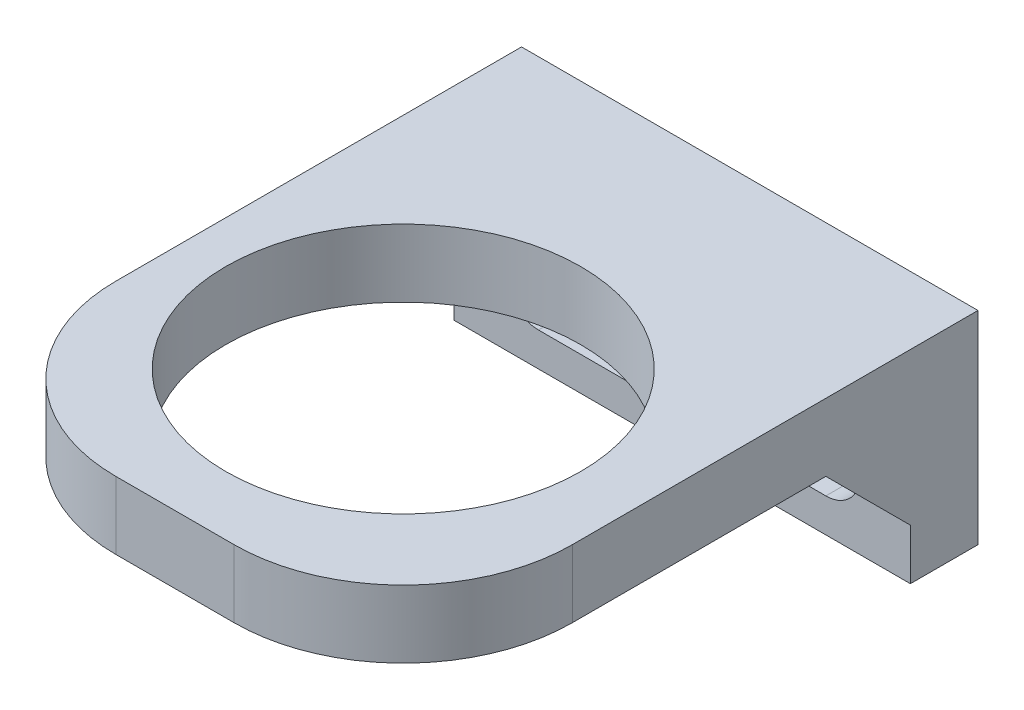
ISO-10303-21;
HEADER;
FILE_DESCRIPTION(('STEP AP214'),'2;1');
FILE_NAME('part.step','',(''),(''),'','','');
FILE_SCHEMA(('AUTOMOTIVE_DESIGN { 1 0 10303 214 1 1 1 1 }'));
ENDSEC;
DATA;
#1=APPLICATION_CONTEXT('core data for automotive mechanical design processes');
#2=APPLICATION_PROTOCOL_DEFINITION('international standard','automotive_design',2000,#1);
#3=PRODUCT_CONTEXT('',#1,'mechanical');
#4=PRODUCT('Part','Part','',(#3));
#5=PRODUCT_RELATED_PRODUCT_CATEGORY('part','',(#4));
#6=PRODUCT_DEFINITION_FORMATION('','',#4);
#7=PRODUCT_DEFINITION_CONTEXT('part definition',#1,'design');
#8=PRODUCT_DEFINITION('design','',#6,#7);
#9=PRODUCT_DEFINITION_SHAPE('','',#8);
#10=(LENGTH_UNIT() NAMED_UNIT(*) SI_UNIT(.MILLI.,.METRE.));
#11=(NAMED_UNIT(*) PLANE_ANGLE_UNIT() SI_UNIT($,.RADIAN.));
#12=(NAMED_UNIT(*) SI_UNIT($,.STERADIAN.) SOLID_ANGLE_UNIT());
#13=UNCERTAINTY_MEASURE_WITH_UNIT(LENGTH_MEASURE(1.E-05),#10,'distance_accuracy_value','');
#14=(GEOMETRIC_REPRESENTATION_CONTEXT(3) GLOBAL_UNCERTAINTY_ASSIGNED_CONTEXT((#13)) GLOBAL_UNIT_ASSIGNED_CONTEXT((#10,
#11,#12)) REPRESENTATION_CONTEXT('',''));
#15=CARTESIAN_POINT('',(0.,0.,0.));
#16=DIRECTION('',(0.,0.,1.));
#17=DIRECTION('',(1.,0.,0.));
#18=AXIS2_PLACEMENT_3D('',#15,#16,#17);
#19=CARTESIAN_POINT('',(0.,0.,0.));
#20=DIRECTION('',(0.,1.,0.));
#21=DIRECTION('',(0.,0.,1.));
#22=AXIS2_PLACEMENT_3D('',#19,#20,#21);
#23=PLANE('',#22);
#24=CARTESIAN_POINT('',(0.,0.,0.));
#25=DIRECTION('',(0.,1.,0.));
#26=DIRECTION('',(0.,0.,1.));
#27=AXIS2_PLACEMENT_3D('',#24,#25,#26);
#28=CIRCLE('',#27,10.5);
#29=CARTESIAN_POINT('',(0.,0.,10.5));
#30=VERTEX_POINT('',#29);
#31=EDGE_CURVE('E266',#30,#30,#28,.T.);
#32=ORIENTED_EDGE('',*,*,#31,.T.);
#33=EDGE_LOOP('',(#32));
#34=FACE_BOUND('',#33,.T.);
#35=DIRECTION('',(1.,0.,0.));
#36=VECTOR('',#35,1.);
#37=CARTESIAN_POINT('',(-13.,0.,14.));
#38=LINE('',#37,#36);
#39=CARTESIAN_POINT('',(-3.,0.,14.));
#40=VERTEX_POINT('',#39);
#41=CARTESIAN_POINT('',(4.,0.,14.));
#42=VERTEX_POINT('',#41);
#43=EDGE_CURVE('E252',#40,#42,#38,.T.);
#44=ORIENTED_EDGE('',*,*,#43,.F.);
#45=CARTESIAN_POINT('',(-3.,0.,4.));
#46=DIRECTION('',(0.,1.,0.));
#47=DIRECTION('',(0.,0.,1.));
#48=AXIS2_PLACEMENT_3D('',#45,#46,#47);
#49=CIRCLE('',#48,10.);
#50=CARTESIAN_POINT('',(-13.,0.,4.));
#51=VERTEX_POINT('',#50);
#52=EDGE_CURVE('E303',#40,#51,#49,.F.);
#53=ORIENTED_EDGE('',*,*,#52,.T.);
#54=DIRECTION('',(0.,0.,1.));
#55=VECTOR('',#54,1.);
#56=CARTESIAN_POINT('',(-13.,0.,-20.));
#57=LINE('',#56,#55);
#58=CARTESIAN_POINT('',(-13.,0.,-11.0000000000001));
#59=VERTEX_POINT('',#58);
#60=EDGE_CURVE('E238',#59,#51,#57,.T.);
#61=ORIENTED_EDGE('',*,*,#60,.F.);
#62=DIRECTION('',(-1.,0.,0.));
#63=VECTOR('',#62,1.);
#64=CARTESIAN_POINT('',(-11.,0.,-11.0000000000001));
#65=LINE('',#64,#63);
#66=CARTESIAN_POINT('',(-11.,0.,-11.0000000000001));
#67=VERTEX_POINT('',#66);
#68=EDGE_CURVE('E215',#67,#59,#65,.T.);
#69=ORIENTED_EDGE('',*,*,#68,.F.);
#70=DIRECTION('',(0.,0.,-1.));
#71=VECTOR('',#70,1.);
#72=CARTESIAN_POINT('',(-11.,0.,-11.0000000000001));
#73=LINE('',#72,#71);
#74=CARTESIAN_POINT('',(-11.,0.,-16.));
#75=VERTEX_POINT('',#74);
#76=EDGE_CURVE('E203',#67,#75,#73,.T.);
#77=ORIENTED_EDGE('',*,*,#76,.T.);
#78=DIRECTION('',(-1.,0.,0.));
#79=VECTOR('',#78,1.);
#80=CARTESIAN_POINT('',(-13.,0.,-16.));
#81=LINE('',#80,#79);
#82=CARTESIAN_POINT('',(12.,0.,-16.));
#83=VERTEX_POINT('',#82);
#84=EDGE_CURVE('E217',#83,#75,#81,.T.);
#85=ORIENTED_EDGE('',*,*,#84,.F.);
#86=DIRECTION('',(0.,0.,1.));
#87=VECTOR('',#86,1.);
#88=CARTESIAN_POINT('',(12.,0.,-16.));
#89=LINE('',#88,#87);
#90=CARTESIAN_POINT('',(12.,0.,-11.));
#91=VERTEX_POINT('',#90);
#92=EDGE_CURVE('E189',#83,#91,#89,.T.);
#93=ORIENTED_EDGE('',*,*,#92,.T.);
#94=DIRECTION('',(1.,0.,0.));
#95=VECTOR('',#94,1.);
#96=CARTESIAN_POINT('',(12.,0.,-11.));
#97=LINE('',#96,#95);
#98=CARTESIAN_POINT('',(14.,0.,-11.));
#99=VERTEX_POINT('',#98);
#100=EDGE_CURVE('E194',#91,#99,#97,.T.);
#101=ORIENTED_EDGE('',*,*,#100,.T.);
#102=DIRECTION('',(0.,0.,-1.));
#103=VECTOR('',#102,1.);
#104=CARTESIAN_POINT('',(14.,0.,-20.));
#105=LINE('',#104,#103);
#106=CARTESIAN_POINT('',(14.,0.,4.));
#107=VERTEX_POINT('',#106);
#108=EDGE_CURVE('E248',#107,#99,#105,.T.);
#109=ORIENTED_EDGE('',*,*,#108,.F.);
#110=CARTESIAN_POINT('',(4.,0.,4.));
#111=DIRECTION('',(0.,1.,0.));
#112=DIRECTION('',(0.,0.,1.));
#113=AXIS2_PLACEMENT_3D('',#110,#111,#112);
#114=CIRCLE('',#113,10.);
#115=EDGE_CURVE('E247',#107,#42,#114,.F.);
#116=ORIENTED_EDGE('',*,*,#115,.T.);
#117=EDGE_LOOP('',(#44,#53,#61,#69,#77,#85,#93,#101,#109,#116));
#118=FACE_BOUND('',#117,.T.);
#119=ADVANCED_FACE('F37',(#34,#118),#23,.F.);
#120=CARTESIAN_POINT('',(0.,4.,0.));
#121=DIRECTION('',(0.,1.,0.));
#122=DIRECTION('',(0.,0.,1.));
#123=AXIS2_PLACEMENT_3D('',#120,#121,#122);
#124=PLANE('',#123);
#125=DIRECTION('',(0.,0.,1.));
#126=VECTOR('',#125,1.);
#127=CARTESIAN_POINT('',(-13.,4.,-20.));
#128=LINE('',#127,#126);
#129=CARTESIAN_POINT('',(-13.,4.,-20.));
#130=VERTEX_POINT('',#129);
#131=CARTESIAN_POINT('',(-13.,4.,4.));
#132=VERTEX_POINT('',#131);
#133=EDGE_CURVE('E251',#130,#132,#128,.T.);
#134=ORIENTED_EDGE('',*,*,#133,.T.);
#135=CARTESIAN_POINT('',(-3.,4.,4.));
#136=DIRECTION('',(0.,1.,0.));
#137=DIRECTION('',(0.,0.,1.));
#138=AXIS2_PLACEMENT_3D('',#135,#136,#137);
#139=CIRCLE('',#138,10.);
#140=CARTESIAN_POINT('',(-3.,4.,14.));
#141=VERTEX_POINT('',#140);
#142=EDGE_CURVE('E45',#132,#141,#139,.T.);
#143=ORIENTED_EDGE('',*,*,#142,.T.);
#144=DIRECTION('',(1.,0.,0.));
#145=VECTOR('',#144,1.);
#146=CARTESIAN_POINT('',(-13.,4.,14.));
#147=LINE('',#146,#145);
#148=CARTESIAN_POINT('',(4.,4.,14.));
#149=VERTEX_POINT('',#148);
#150=EDGE_CURVE('E278',#141,#149,#147,.T.);
#151=ORIENTED_EDGE('',*,*,#150,.T.);
#152=CARTESIAN_POINT('',(4.,4.,4.));
#153=DIRECTION('',(0.,1.,0.));
#154=DIRECTION('',(0.,0.,1.));
#155=AXIS2_PLACEMENT_3D('',#152,#153,#154);
#156=CIRCLE('',#155,10.);
#157=CARTESIAN_POINT('',(14.,4.,4.));
#158=VERTEX_POINT('',#157);
#159=EDGE_CURVE('E302',#149,#158,#156,.T.);
#160=ORIENTED_EDGE('',*,*,#159,.T.);
#161=DIRECTION('',(0.,0.,-1.));
#162=VECTOR('',#161,1.);
#163=CARTESIAN_POINT('',(14.,4.,-20.));
#164=LINE('',#163,#162);
#165=CARTESIAN_POINT('',(14.,4.,-20.));
#166=VERTEX_POINT('',#165);
#167=EDGE_CURVE('E281',#158,#166,#164,.T.);
#168=ORIENTED_EDGE('',*,*,#167,.T.);
#169=DIRECTION('',(-1.,0.,0.));
#170=VECTOR('',#169,1.);
#171=CARTESIAN_POINT('',(-13.,4.,-20.));
#172=LINE('',#171,#170);
#173=EDGE_CURVE('E259',#166,#130,#172,.T.);
#174=ORIENTED_EDGE('',*,*,#173,.T.);
#175=EDGE_LOOP('',(#134,#143,#151,#160,#168,#174));
#176=FACE_BOUND('',#175,.T.);
#177=CARTESIAN_POINT('',(0.,4.,0.));
#178=DIRECTION('',(0.,1.,0.));
#179=DIRECTION('',(0.,0.,1.));
#180=AXIS2_PLACEMENT_3D('',#177,#178,#179);
#181=CIRCLE('',#180,10.5);
#182=CARTESIAN_POINT('',(0.,4.,10.5));
#183=VERTEX_POINT('',#182);
#184=EDGE_CURVE('E233',#183,#183,#181,.T.);
#185=ORIENTED_EDGE('',*,*,#184,.F.);
#186=EDGE_LOOP('',(#185));
#187=FACE_BOUND('',#186,.T.);
#188=ADVANCED_FACE('F287',(#176,#187),#124,.T.);
#189=CARTESIAN_POINT('',(-13.,4.,-20.));
#190=DIRECTION('',(1.,0.,0.));
#191=DIRECTION('',(0.,0.,-1.));
#192=AXIS2_PLACEMENT_3D('',#189,#190,#191);
#193=PLANE('',#192);
#194=ORIENTED_EDGE('',*,*,#60,.T.);
#195=DIRECTION('',(0.,-1.,0.));
#196=VECTOR('',#195,1.);
#197=CARTESIAN_POINT('',(-13.,4.,4.));
#198=LINE('',#197,#196);
#199=EDGE_CURVE('E299',#51,#132,#198,.F.);
#200=ORIENTED_EDGE('',*,*,#199,.T.);
#201=ORIENTED_EDGE('',*,*,#133,.F.);
#202=DIRECTION('',(0.,-1.,0.));
#203=VECTOR('',#202,1.);
#204=CARTESIAN_POINT('',(-13.,4.,-20.));
#205=LINE('',#204,#203);
#206=CARTESIAN_POINT('',(-13.,-8.,-20.));
#207=VERTEX_POINT('',#206);
#208=EDGE_CURVE('E257',#130,#207,#205,.T.);
#209=ORIENTED_EDGE('',*,*,#208,.T.);
#210=DIRECTION('',(0.,0.,-1.));
#211=VECTOR('',#210,1.);
#212=CARTESIAN_POINT('',(-13.,-8.,-20.));
#213=LINE('',#212,#211);
#214=CARTESIAN_POINT('',(-13.,-8.,-16.));
#215=VERTEX_POINT('',#214);
#216=EDGE_CURVE('E220',#215,#207,#213,.T.);
#217=ORIENTED_EDGE('',*,*,#216,.F.);
#218=DIRECTION('',(0.,1.,0.));
#219=VECTOR('',#218,1.);
#220=CARTESIAN_POINT('',(-13.,-8.,-16.));
#221=LINE('',#220,#219);
#222=CARTESIAN_POINT('',(-13.,-5.,-16.));
#223=VERTEX_POINT('',#222);
#224=EDGE_CURVE('E230',#215,#223,#221,.T.);
#225=ORIENTED_EDGE('',*,*,#224,.T.);
#226=DIRECTION('',(0.,0.707106781186552,0.707106781186543));
#227=VECTOR('',#226,1.);
#228=CARTESIAN_POINT('',(-13.,-5.,-16.));
#229=LINE('',#228,#227);
#230=EDGE_CURVE('E200',#223,#59,#229,.T.);
#231=ORIENTED_EDGE('',*,*,#230,.T.);
#232=EDGE_LOOP('',(#194,#200,#201,#209,#217,#225,#231));
#233=FACE_BOUND('',#232,.T.);
#234=ADVANCED_FACE('F297',(#233),#193,.F.);
#235=CARTESIAN_POINT('',(-13.,4.,14.));
#236=DIRECTION('',(0.,0.,-1.));
#237=DIRECTION('',(-1.,0.,0.));
#238=AXIS2_PLACEMENT_3D('',#235,#236,#237);
#239=PLANE('',#238);
#240=ORIENTED_EDGE('',*,*,#150,.F.);
#241=DIRECTION('',(0.,-1.,0.));
#242=VECTOR('',#241,1.);
#243=CARTESIAN_POINT('',(-3.,4.,14.));
#244=LINE('',#243,#242);
#245=EDGE_CURVE('E243',#141,#40,#244,.T.);
#246=ORIENTED_EDGE('',*,*,#245,.T.);
#247=ORIENTED_EDGE('',*,*,#43,.T.);
#248=DIRECTION('',(0.,-1.,0.));
#249=VECTOR('',#248,1.);
#250=CARTESIAN_POINT('',(4.,4.,14.));
#251=LINE('',#250,#249);
#252=EDGE_CURVE('E241',#42,#149,#251,.F.);
#253=ORIENTED_EDGE('',*,*,#252,.T.);
#254=EDGE_LOOP('',(#240,#246,#247,#253));
#255=FACE_BOUND('',#254,.T.);
#256=ADVANCED_FACE('F310',(#255),#239,.F.);
#257=CARTESIAN_POINT('',(14.,4.,-20.));
#258=DIRECTION('',(-1.,0.,0.));
#259=DIRECTION('',(0.,0.,1.));
#260=AXIS2_PLACEMENT_3D('',#257,#258,#259);
#261=PLANE('',#260);
#262=ORIENTED_EDGE('',*,*,#167,.F.);
#263=DIRECTION('',(0.,-1.,0.));
#264=VECTOR('',#263,1.);
#265=CARTESIAN_POINT('',(14.,4.,4.));
#266=LINE('',#265,#264);
#267=EDGE_CURVE('E11',#158,#107,#266,.T.);
#268=ORIENTED_EDGE('',*,*,#267,.T.);
#269=ORIENTED_EDGE('',*,*,#108,.T.);
#270=DIRECTION('',(0.,-0.707106781186544,-0.707106781186551));
#271=VECTOR('',#270,1.);
#272=CARTESIAN_POINT('',(14.,0.,-11.));
#273=LINE('',#272,#271);
#274=CARTESIAN_POINT('',(14.,-5.,-16.));
#275=VERTEX_POINT('',#274);
#276=EDGE_CURVE('E183',#99,#275,#273,.T.);
#277=ORIENTED_EDGE('',*,*,#276,.T.);
#278=DIRECTION('',(0.,1.,0.));
#279=VECTOR('',#278,1.);
#280=CARTESIAN_POINT('',(14.,-8.,-16.));
#281=LINE('',#280,#279);
#282=CARTESIAN_POINT('',(14.,-8.,-16.));
#283=VERTEX_POINT('',#282);
#284=EDGE_CURVE('E263',#283,#275,#281,.T.);
#285=ORIENTED_EDGE('',*,*,#284,.F.);
#286=DIRECTION('',(0.,0.,1.));
#287=VECTOR('',#286,1.);
#288=CARTESIAN_POINT('',(14.,-8.,-20.));
#289=LINE('',#288,#287);
#290=CARTESIAN_POINT('',(14.,-8.,-20.));
#291=VERTEX_POINT('',#290);
#292=EDGE_CURVE('E226',#291,#283,#289,.T.);
#293=ORIENTED_EDGE('',*,*,#292,.F.);
#294=DIRECTION('',(0.,-1.,0.));
#295=VECTOR('',#294,1.);
#296=CARTESIAN_POINT('',(14.,4.,-20.));
#297=LINE('',#296,#295);
#298=EDGE_CURVE('E244',#166,#291,#297,.T.);
#299=ORIENTED_EDGE('',*,*,#298,.F.);
#300=EDGE_LOOP('',(#262,#268,#269,#277,#285,#293,#299));
#301=FACE_BOUND('',#300,.T.);
#302=ADVANCED_FACE('F321',(#301),#261,.F.);
#303=CARTESIAN_POINT('',(-13.,4.,-20.));
#304=DIRECTION('',(0.,0.,1.));
#305=DIRECTION('',(1.,0.,0.));
#306=AXIS2_PLACEMENT_3D('',#303,#304,#305);
#307=PLANE('',#306);
#308=DIRECTION('',(-1.,0.,0.));
#309=VECTOR('',#308,1.);
#310=CARTESIAN_POINT('',(-8.,-2.,-20.));
#311=LINE('',#310,#309);
#312=CARTESIAN_POINT('',(9.,-2.,-20.));
#313=VERTEX_POINT('',#312);
#314=CARTESIAN_POINT('',(-8.,-2.,-20.));
#315=VERTEX_POINT('',#314);
#316=EDGE_CURVE('E158',#313,#315,#311,.T.);
#317=ORIENTED_EDGE('',*,*,#316,.T.);
#318=CARTESIAN_POINT('',(-8.,-4.,-20.));
#319=DIRECTION('',(0.,0.,1.));
#320=DIRECTION('',(1.,0.,0.));
#321=AXIS2_PLACEMENT_3D('',#318,#319,#320);
#322=CIRCLE('',#321,2.);
#323=CARTESIAN_POINT('',(-8.,-6.,-20.));
#324=VERTEX_POINT('',#323);
#325=EDGE_CURVE('E152',#315,#324,#322,.T.);
#326=ORIENTED_EDGE('',*,*,#325,.T.);
#327=DIRECTION('',(1.,0.,0.));
#328=VECTOR('',#327,1.);
#329=CARTESIAN_POINT('',(-8.,-6.,-20.));
#330=LINE('',#329,#328);
#331=CARTESIAN_POINT('',(9.,-6.,-20.));
#332=VERTEX_POINT('',#331);
#333=EDGE_CURVE('E161',#324,#332,#330,.T.);
#334=ORIENTED_EDGE('',*,*,#333,.T.);
#335=CARTESIAN_POINT('',(9.,-4.,-20.));
#336=DIRECTION('',(0.,0.,1.));
#337=DIRECTION('',(1.,0.,0.));
#338=AXIS2_PLACEMENT_3D('',#335,#336,#337);
#339=CIRCLE('',#338,2.);
#340=EDGE_CURVE('E52',#332,#313,#339,.T.);
#341=ORIENTED_EDGE('',*,*,#340,.T.);
#342=EDGE_LOOP('',(#317,#326,#334,#341));
#343=FACE_BOUND('',#342,.T.);
#344=ORIENTED_EDGE('',*,*,#298,.T.);
#345=DIRECTION('',(1.,0.,0.));
#346=VECTOR('',#345,1.);
#347=CARTESIAN_POINT('',(-13.,-8.,-20.));
#348=LINE('',#347,#346);
#349=EDGE_CURVE('E223',#207,#291,#348,.T.);
#350=ORIENTED_EDGE('',*,*,#349,.F.);
#351=ORIENTED_EDGE('',*,*,#208,.F.);
#352=ORIENTED_EDGE('',*,*,#173,.F.);
#353=EDGE_LOOP('',(#344,#350,#351,#352));
#354=FACE_BOUND('',#353,.T.);
#355=ADVANCED_FACE('F165',(#343,#354),#307,.F.);
#356=CARTESIAN_POINT('',(0.,4.,0.));
#357=DIRECTION('',(0.,-1.,0.));
#358=DIRECTION('',(0.,0.,-1.));
#359=AXIS2_PLACEMENT_3D('',#356,#357,#358);
#360=CYLINDRICAL_SURFACE('',#359,10.5);
#361=ORIENTED_EDGE('',*,*,#184,.T.);
#362=EDGE_LOOP('',(#361));
#363=FACE_BOUND('',#362,.T.);
#364=ORIENTED_EDGE('',*,*,#31,.F.);
#365=EDGE_LOOP('',(#364));
#366=FACE_BOUND('',#365,.T.);
#367=ADVANCED_FACE('F361',(#363,#366),#360,.F.);
#368=CARTESIAN_POINT('',(-13.,-8.,-16.));
#369=DIRECTION('',(0.,0.,-1.));
#370=DIRECTION('',(-1.,0.,0.));
#371=AXIS2_PLACEMENT_3D('',#368,#369,#370);
#372=PLANE('',#371);
#373=DIRECTION('',(1.,0.,0.));
#374=VECTOR('',#373,1.);
#375=CARTESIAN_POINT('',(-8.,-6.,-16.));
#376=LINE('',#375,#374);
#377=CARTESIAN_POINT('',(-8.,-6.,-16.));
#378=VERTEX_POINT('',#377);
#379=CARTESIAN_POINT('',(9.,-6.,-16.));
#380=VERTEX_POINT('',#379);
#381=EDGE_CURVE('E177',#378,#380,#376,.T.);
#382=ORIENTED_EDGE('',*,*,#381,.F.);
#383=CARTESIAN_POINT('',(-8.,-4.,-16.));
#384=DIRECTION('',(0.,0.,1.));
#385=DIRECTION('',(1.,0.,0.));
#386=AXIS2_PLACEMENT_3D('',#383,#384,#385);
#387=CIRCLE('',#386,2.);
#388=CARTESIAN_POINT('',(-8.,-2.,-16.));
#389=VERTEX_POINT('',#388);
#390=EDGE_CURVE('E60',#389,#378,#387,.T.);
#391=ORIENTED_EDGE('',*,*,#390,.F.);
#392=DIRECTION('',(-1.,0.,0.));
#393=VECTOR('',#392,1.);
#394=CARTESIAN_POINT('',(-8.,-2.,-16.));
#395=LINE('',#394,#393);
#396=CARTESIAN_POINT('',(9.,-2.,-16.));
#397=VERTEX_POINT('',#396);
#398=EDGE_CURVE('E168',#397,#389,#395,.T.);
#399=ORIENTED_EDGE('',*,*,#398,.F.);
#400=CARTESIAN_POINT('',(9.,-4.,-16.));
#401=DIRECTION('',(0.,0.,1.));
#402=DIRECTION('',(1.,0.,0.));
#403=AXIS2_PLACEMENT_3D('',#400,#401,#402);
#404=CIRCLE('',#403,2.);
#405=EDGE_CURVE('E171',#380,#397,#404,.T.);
#406=ORIENTED_EDGE('',*,*,#405,.F.);
#407=EDGE_LOOP('',(#382,#391,#399,#406));
#408=FACE_BOUND('',#407,.T.);
#409=ORIENTED_EDGE('',*,*,#284,.T.);
#410=DIRECTION('',(1.,0.,0.));
#411=VECTOR('',#410,1.);
#412=CARTESIAN_POINT('',(12.,-5.,-16.));
#413=LINE('',#412,#411);
#414=CARTESIAN_POINT('',(12.,-5.,-16.));
#415=VERTEX_POINT('',#414);
#416=EDGE_CURVE('E197',#415,#275,#413,.T.);
#417=ORIENTED_EDGE('',*,*,#416,.F.);
#418=DIRECTION('',(0.,1.,0.));
#419=VECTOR('',#418,1.);
#420=CARTESIAN_POINT('',(12.,-5.,-16.));
#421=LINE('',#420,#419);
#422=EDGE_CURVE('E187',#415,#83,#421,.T.);
#423=ORIENTED_EDGE('',*,*,#422,.T.);
#424=ORIENTED_EDGE('',*,*,#84,.T.);
#425=DIRECTION('',(0.,-1.,0.));
#426=VECTOR('',#425,1.);
#427=CARTESIAN_POINT('',(-11.,0.,-16.));
#428=LINE('',#427,#426);
#429=CARTESIAN_POINT('',(-11.,-5.,-16.));
#430=VERTEX_POINT('',#429);
#431=EDGE_CURVE('E206',#75,#430,#428,.T.);
#432=ORIENTED_EDGE('',*,*,#431,.T.);
#433=DIRECTION('',(-1.,0.,0.));
#434=VECTOR('',#433,1.);
#435=CARTESIAN_POINT('',(-11.,-5.,-16.));
#436=LINE('',#435,#434);
#437=EDGE_CURVE('E212',#430,#223,#436,.T.);
#438=ORIENTED_EDGE('',*,*,#437,.T.);
#439=ORIENTED_EDGE('',*,*,#224,.F.);
#440=DIRECTION('',(-1.,0.,0.));
#441=VECTOR('',#440,1.);
#442=CARTESIAN_POINT('',(-13.,-8.,-16.));
#443=LINE('',#442,#441);
#444=EDGE_CURVE('E228',#283,#215,#443,.T.);
#445=ORIENTED_EDGE('',*,*,#444,.F.);
#446=EDGE_LOOP('',(#409,#417,#423,#424,#432,#438,#439,#445));
#447=FACE_BOUND('',#446,.T.);
#448=ADVANCED_FACE('F326',(#408,#447),#372,.F.);
#449=CARTESIAN_POINT('',(0.,-8.,0.));
#450=DIRECTION('',(0.,1.,0.));
#451=DIRECTION('',(0.,0.,1.));
#452=AXIS2_PLACEMENT_3D('',#449,#450,#451);
#453=PLANE('',#452);
#454=ORIENTED_EDGE('',*,*,#216,.T.);
#455=ORIENTED_EDGE('',*,*,#349,.T.);
#456=ORIENTED_EDGE('',*,*,#292,.T.);
#457=ORIENTED_EDGE('',*,*,#444,.T.);
#458=EDGE_LOOP('',(#454,#455,#456,#457));
#459=FACE_BOUND('',#458,.T.);
#460=ADVANCED_FACE('F324',(#459),#453,.F.);
#461=CARTESIAN_POINT('',(-11.,-5.,-16.));
#462=DIRECTION('',(0.,-0.707106781186543,0.707106781186552));
#463=DIRECTION('',(0.,-0.707106781186552,-0.707106781186543));
#464=AXIS2_PLACEMENT_3D('',#461,#462,#463);
#465=PLANE('',#464);
#466=ORIENTED_EDGE('',*,*,#230,.F.);
#467=ORIENTED_EDGE('',*,*,#437,.F.);
#468=DIRECTION('',(0.,0.707106781186552,0.707106781186543));
#469=VECTOR('',#468,1.);
#470=CARTESIAN_POINT('',(-11.,-5.,-16.));
#471=LINE('',#470,#469);
#472=EDGE_CURVE('E209',#430,#67,#471,.T.);
#473=ORIENTED_EDGE('',*,*,#472,.T.);
#474=ORIENTED_EDGE('',*,*,#68,.T.);
#475=EDGE_LOOP('',(#466,#467,#473,#474));
#476=FACE_BOUND('',#475,.T.);
#477=ADVANCED_FACE('F330',(#476),#465,.T.);
#478=CARTESIAN_POINT('',(-11.,0.,0.));
#479=DIRECTION('',(-1.,0.,0.));
#480=DIRECTION('',(0.,0.,1.));
#481=AXIS2_PLACEMENT_3D('',#478,#479,#480);
#482=PLANE('',#481);
#483=ORIENTED_EDGE('',*,*,#76,.F.);
#484=ORIENTED_EDGE('',*,*,#472,.F.);
#485=ORIENTED_EDGE('',*,*,#431,.F.);
#486=EDGE_LOOP('',(#483,#484,#485));
#487=FACE_BOUND('',#486,.T.);
#488=ADVANCED_FACE('F332',(#487),#482,.F.);
#489=CARTESIAN_POINT('',(12.,0.,-11.));
#490=DIRECTION('',(0.,-0.707106781186551,0.707106781186544));
#491=DIRECTION('',(0.,-0.707106781186544,-0.707106781186551));
#492=AXIS2_PLACEMENT_3D('',#489,#490,#491);
#493=PLANE('',#492);
#494=ORIENTED_EDGE('',*,*,#276,.F.);
#495=ORIENTED_EDGE('',*,*,#100,.F.);
#496=DIRECTION('',(0.,-0.707106781186544,-0.707106781186551));
#497=VECTOR('',#496,1.);
#498=CARTESIAN_POINT('',(12.,0.,-11.));
#499=LINE('',#498,#497);
#500=EDGE_CURVE('E191',#91,#415,#499,.T.);
#501=ORIENTED_EDGE('',*,*,#500,.T.);
#502=ORIENTED_EDGE('',*,*,#416,.T.);
#503=EDGE_LOOP('',(#494,#495,#501,#502));
#504=FACE_BOUND('',#503,.T.);
#505=ADVANCED_FACE('F342',(#504),#493,.T.);
#506=CARTESIAN_POINT('',(12.,0.,0.));
#507=DIRECTION('',(1.,0.,0.));
#508=DIRECTION('',(0.,0.,-1.));
#509=AXIS2_PLACEMENT_3D('',#506,#507,#508);
#510=PLANE('',#509);
#511=ORIENTED_EDGE('',*,*,#422,.F.);
#512=ORIENTED_EDGE('',*,*,#500,.F.);
#513=ORIENTED_EDGE('',*,*,#92,.F.);
#514=EDGE_LOOP('',(#511,#512,#513));
#515=FACE_BOUND('',#514,.T.);
#516=ADVANCED_FACE('F339',(#515),#510,.F.);
#517=CARTESIAN_POINT('',(-3.,4.,4.));
#518=DIRECTION('',(0.,-1.,0.));
#519=DIRECTION('',(0.,0.,-1.));
#520=AXIS2_PLACEMENT_3D('',#517,#518,#519);
#521=CYLINDRICAL_SURFACE('',#520,10.);
#522=ORIENTED_EDGE('',*,*,#142,.F.);
#523=ORIENTED_EDGE('',*,*,#199,.F.);
#524=ORIENTED_EDGE('',*,*,#52,.F.);
#525=ORIENTED_EDGE('',*,*,#245,.F.);
#526=EDGE_LOOP('',(#522,#523,#524,#525));
#527=FACE_BOUND('',#526,.T.);
#528=ADVANCED_FACE('F314',(#527),#521,.T.);
#529=CARTESIAN_POINT('',(4.,4.,4.));
#530=DIRECTION('',(0.,-1.,0.));
#531=DIRECTION('',(0.,0.,-1.));
#532=AXIS2_PLACEMENT_3D('',#529,#530,#531);
#533=CYLINDRICAL_SURFACE('',#532,10.);
#534=ORIENTED_EDGE('',*,*,#159,.F.);
#535=ORIENTED_EDGE('',*,*,#252,.F.);
#536=ORIENTED_EDGE('',*,*,#115,.F.);
#537=ORIENTED_EDGE('',*,*,#267,.F.);
#538=EDGE_LOOP('',(#534,#535,#536,#537));
#539=FACE_BOUND('',#538,.T.);
#540=ADVANCED_FACE('F39',(#539),#533,.T.);
#541=CARTESIAN_POINT('',(-8.,-4.,-20.));
#542=DIRECTION('',(0.,0.,1.));
#543=DIRECTION('',(1.,0.,0.));
#544=AXIS2_PLACEMENT_3D('',#541,#542,#543);
#545=CYLINDRICAL_SURFACE('',#544,2.);
#546=ORIENTED_EDGE('',*,*,#390,.T.);
#547=DIRECTION('',(0.,0.,1.));
#548=VECTOR('',#547,1.);
#549=CARTESIAN_POINT('',(-8.,-6.,-20.));
#550=LINE('',#549,#548);
#551=EDGE_CURVE('E148',#324,#378,#550,.T.);
#552=ORIENTED_EDGE('',*,*,#551,.F.);
#553=ORIENTED_EDGE('',*,*,#325,.F.);
#554=DIRECTION('',(0.,0.,1.));
#555=VECTOR('',#554,1.);
#556=CARTESIAN_POINT('',(-8.,-2.,-20.));
#557=LINE('',#556,#555);
#558=EDGE_CURVE('E181',#315,#389,#557,.T.);
#559=ORIENTED_EDGE('',*,*,#558,.T.);
#560=EDGE_LOOP('',(#546,#552,#553,#559));
#561=FACE_BOUND('',#560,.T.);
#562=ADVANCED_FACE('F150',(#561),#545,.F.);
#563=CARTESIAN_POINT('',(-8.,-2.,-20.));
#564=DIRECTION('',(0.,1.,0.));
#565=DIRECTION('',(-1.,0.,0.));
#566=AXIS2_PLACEMENT_3D('',#563,#564,#565);
#567=PLANE('',#566);
#568=ORIENTED_EDGE('',*,*,#398,.T.);
#569=ORIENTED_EDGE('',*,*,#558,.F.);
#570=ORIENTED_EDGE('',*,*,#316,.F.);
#571=DIRECTION('',(0.,0.,1.));
#572=VECTOR('',#571,1.);
#573=CARTESIAN_POINT('',(9.,-2.,-20.));
#574=LINE('',#573,#572);
#575=EDGE_CURVE('E184',#313,#397,#574,.T.);
#576=ORIENTED_EDGE('',*,*,#575,.T.);
#577=EDGE_LOOP('',(#568,#569,#570,#576));
#578=FACE_BOUND('',#577,.T.);
#579=ADVANCED_FACE('F374',(#578),#567,.F.);
#580=CARTESIAN_POINT('',(9.,-4.,-20.));
#581=DIRECTION('',(0.,0.,1.));
#582=DIRECTION('',(1.,0.,0.));
#583=AXIS2_PLACEMENT_3D('',#580,#581,#582);
#584=CYLINDRICAL_SURFACE('',#583,2.);
#585=ORIENTED_EDGE('',*,*,#405,.T.);
#586=ORIENTED_EDGE('',*,*,#575,.F.);
#587=ORIENTED_EDGE('',*,*,#340,.F.);
#588=DIRECTION('',(0.,0.,1.));
#589=VECTOR('',#588,1.);
#590=CARTESIAN_POINT('',(9.,-6.,-20.));
#591=LINE('',#590,#589);
#592=EDGE_CURVE('E157',#332,#380,#591,.T.);
#593=ORIENTED_EDGE('',*,*,#592,.T.);
#594=EDGE_LOOP('',(#585,#586,#587,#593));
#595=FACE_BOUND('',#594,.T.);
#596=ADVANCED_FACE('F379',(#595),#584,.F.);
#597=CARTESIAN_POINT('',(-8.,-6.,-20.));
#598=DIRECTION('',(0.,-1.,0.));
#599=DIRECTION('',(0.,0.,-1.));
#600=AXIS2_PLACEMENT_3D('',#597,#598,#599);
#601=PLANE('',#600);
#602=ORIENTED_EDGE('',*,*,#381,.T.);
#603=ORIENTED_EDGE('',*,*,#592,.F.);
#604=ORIENTED_EDGE('',*,*,#333,.F.);
#605=ORIENTED_EDGE('',*,*,#551,.T.);
#606=EDGE_LOOP('',(#602,#603,#604,#605));
#607=FACE_BOUND('',#606,.T.);
#608=ADVANCED_FACE('F162',(#607),#601,.F.);
#609=CLOSED_SHELL('',(#119,#188,#234,#256,#302,#355,#367,#448,#460,#477,#488,#505,#516,#528,
#540,#562,#579,#596,#608));
#610=MANIFOLD_SOLID_BREP('B2',#609);
#611=ADVANCED_BREP_SHAPE_REPRESENTATION('',(#18,#610),#14);
#612=SHAPE_DEFINITION_REPRESENTATION(#9,#611);
ENDSEC;
END-ISO-10303-21;
